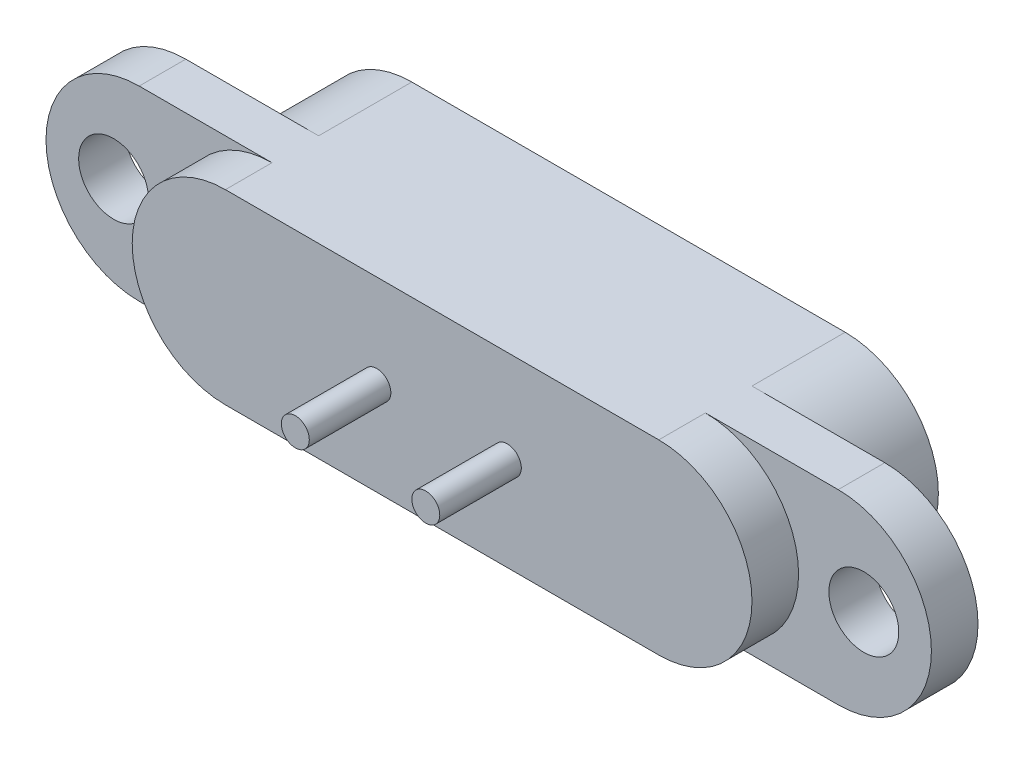
ISO-10303-21;
HEADER;
FILE_DESCRIPTION(('STEP AP214'),'2;1');
FILE_NAME('part.step','',(''),(''),'','','');
FILE_SCHEMA(('AUTOMOTIVE_DESIGN { 1 0 10303 214 1 1 1 1 }'));
ENDSEC;
DATA;
#1=APPLICATION_CONTEXT('core data for automotive mechanical design processes');
#2=APPLICATION_PROTOCOL_DEFINITION('international standard','automotive_design',2000,#1);
#3=PRODUCT_CONTEXT('',#1,'mechanical');
#4=PRODUCT('Part','Part','',(#3));
#5=PRODUCT_RELATED_PRODUCT_CATEGORY('part','',(#4));
#6=PRODUCT_DEFINITION_FORMATION('','',#4);
#7=PRODUCT_DEFINITION_CONTEXT('part definition',#1,'design');
#8=PRODUCT_DEFINITION('design','',#6,#7);
#9=PRODUCT_DEFINITION_SHAPE('','',#8);
#10=(LENGTH_UNIT() NAMED_UNIT(*) SI_UNIT(.MILLI.,.METRE.));
#11=(NAMED_UNIT(*) PLANE_ANGLE_UNIT() SI_UNIT($,.RADIAN.));
#12=(NAMED_UNIT(*) SI_UNIT($,.STERADIAN.) SOLID_ANGLE_UNIT());
#13=UNCERTAINTY_MEASURE_WITH_UNIT(LENGTH_MEASURE(1.E-05),#10,'distance_accuracy_value','');
#14=(GEOMETRIC_REPRESENTATION_CONTEXT(3) GLOBAL_UNCERTAINTY_ASSIGNED_CONTEXT((#13)) GLOBAL_UNIT_ASSIGNED_CONTEXT((#10,
#11,#12)) REPRESENTATION_CONTEXT('',''));
#15=CARTESIAN_POINT('',(0.,0.,0.));
#16=DIRECTION('',(0.,0.,1.));
#17=DIRECTION('',(1.,0.,0.));
#18=AXIS2_PLACEMENT_3D('',#15,#16,#17);
#19=CARTESIAN_POINT('',(0.,0.,4.));
#20=DIRECTION('',(0.,0.,-1.));
#21=DIRECTION('',(-1.,0.,0.));
#22=AXIS2_PLACEMENT_3D('',#19,#20,#21);
#23=CYLINDRICAL_SURFACE('',#22,2.);
#24=CARTESIAN_POINT('',(0.,0.,3.));
#25=DIRECTION('',(0.,0.,-1.));
#26=DIRECTION('',(-1.,0.,0.));
#27=AXIS2_PLACEMENT_3D('',#24,#25,#26);
#28=CIRCLE('',#27,2.);
#29=CARTESIAN_POINT('',(0.,-2.,3.));
#30=VERTEX_POINT('',#29);
#31=CARTESIAN_POINT('',(0.,2.,3.));
#32=VERTEX_POINT('',#31);
#33=EDGE_CURVE('E178',#30,#32,#28,.T.);
#34=ORIENTED_EDGE('',*,*,#33,.F.);
#35=DIRECTION('',(0.,0.,-1.));
#36=VECTOR('',#35,1.);
#37=CARTESIAN_POINT('',(0.,-2.,4.));
#38=LINE('',#37,#36);
#39=CARTESIAN_POINT('',(0.,-2.,4.));
#40=VERTEX_POINT('',#39);
#41=EDGE_CURVE('E11',#40,#30,#38,.T.);
#42=ORIENTED_EDGE('',*,*,#41,.F.);
#43=CARTESIAN_POINT('',(0.,0.,4.));
#44=DIRECTION('',(0.,0.,1.));
#45=DIRECTION('',(1.,0.,0.));
#46=AXIS2_PLACEMENT_3D('',#43,#44,#45);
#47=CIRCLE('',#46,2.);
#48=CARTESIAN_POINT('',(0.,2.,4.));
#49=VERTEX_POINT('',#48);
#50=EDGE_CURVE('E181',#49,#40,#47,.T.);
#51=ORIENTED_EDGE('',*,*,#50,.F.);
#52=DIRECTION('',(0.,0.,-1.));
#53=VECTOR('',#52,1.);
#54=CARTESIAN_POINT('',(0.,2.,4.));
#55=LINE('',#54,#53);
#56=EDGE_CURVE('E202',#49,#32,#55,.T.);
#57=ORIENTED_EDGE('',*,*,#56,.T.);
#58=EDGE_LOOP('',(#34,#42,#51,#57));
#59=FACE_BOUND('',#58,.T.);
#60=ADVANCED_FACE('F33',(#59),#23,.T.);
#61=CARTESIAN_POINT('',(9.3,0.,4.));
#62=DIRECTION('',(0.,0.,-1.));
#63=DIRECTION('',(-1.,0.,0.));
#64=AXIS2_PLACEMENT_3D('',#61,#62,#63);
#65=CYLINDRICAL_SURFACE('',#64,2.);
#66=CARTESIAN_POINT('',(9.3,0.,3.));
#67=DIRECTION('',(0.,0.,-1.));
#68=DIRECTION('',(-1.,0.,0.));
#69=AXIS2_PLACEMENT_3D('',#66,#67,#68);
#70=CIRCLE('',#69,2.);
#71=CARTESIAN_POINT('',(9.3,2.,3.));
#72=VERTEX_POINT('',#71);
#73=CARTESIAN_POINT('',(9.3,-2.,3.));
#74=VERTEX_POINT('',#73);
#75=EDGE_CURVE('E141',#72,#74,#70,.T.);
#76=ORIENTED_EDGE('',*,*,#75,.F.);
#77=DIRECTION('',(0.,0.,-1.));
#78=VECTOR('',#77,1.);
#79=CARTESIAN_POINT('',(9.3,2.,4.));
#80=LINE('',#79,#78);
#81=CARTESIAN_POINT('',(9.3,2.,4.));
#82=VERTEX_POINT('',#81);
#83=EDGE_CURVE('E206',#82,#72,#80,.T.);
#84=ORIENTED_EDGE('',*,*,#83,.F.);
#85=CARTESIAN_POINT('',(9.3,0.,4.));
#86=DIRECTION('',(0.,0.,1.));
#87=DIRECTION('',(1.,0.,0.));
#88=AXIS2_PLACEMENT_3D('',#85,#86,#87);
#89=CIRCLE('',#88,2.);
#90=CARTESIAN_POINT('',(9.3,-2.,4.));
#91=VERTEX_POINT('',#90);
#92=EDGE_CURVE('E187',#91,#82,#89,.T.);
#93=ORIENTED_EDGE('',*,*,#92,.F.);
#94=DIRECTION('',(0.,0.,-1.));
#95=VECTOR('',#94,1.);
#96=CARTESIAN_POINT('',(9.3,-2.,4.));
#97=LINE('',#96,#95);
#98=EDGE_CURVE('E209',#91,#74,#97,.T.);
#99=ORIENTED_EDGE('',*,*,#98,.T.);
#100=EDGE_LOOP('',(#76,#84,#93,#99));
#101=FACE_BOUND('',#100,.T.);
#102=ADVANCED_FACE('F248',(#101),#65,.T.);
#103=CARTESIAN_POINT('',(0.,-2.,2.));
#104=VERTEX_POINT('',#103);
#105=CARTESIAN_POINT('',(0.,-2.,0.));
#106=VERTEX_POINT('',#105);
#107=EDGE_CURVE('E41',#104,#106,#38,.T.);
#108=ORIENTED_EDGE('',*,*,#107,.F.);
#109=CARTESIAN_POINT('',(0.,0.,2.));
#110=DIRECTION('',(0.,0.,-1.));
#111=DIRECTION('',(-1.,0.,0.));
#112=AXIS2_PLACEMENT_3D('',#109,#110,#111);
#113=CIRCLE('',#112,2.);
#114=CARTESIAN_POINT('',(0.,2.,2.));
#115=VERTEX_POINT('',#114);
#116=EDGE_CURVE('E175',#104,#115,#113,.T.);
#117=ORIENTED_EDGE('',*,*,#116,.T.);
#118=CARTESIAN_POINT('',(0.,2.,0.));
#119=VERTEX_POINT('',#118);
#120=EDGE_CURVE('E191',#115,#119,#55,.T.);
#121=ORIENTED_EDGE('',*,*,#120,.T.);
#122=CARTESIAN_POINT('',(0.,0.,0.));
#123=DIRECTION('',(0.,0.,1.));
#124=DIRECTION('',(1.,0.,0.));
#125=AXIS2_PLACEMENT_3D('',#122,#123,#124);
#126=CIRCLE('',#125,2.);
#127=EDGE_CURVE('E180',#119,#106,#126,.T.);
#128=ORIENTED_EDGE('',*,*,#127,.T.);
#129=EDGE_LOOP('',(#108,#117,#121,#128));
#130=FACE_BOUND('',#129,.T.);
#131=ADVANCED_FACE('F35',(#130),#23,.T.);
#132=CARTESIAN_POINT('',(0.,-2.,4.));
#133=DIRECTION('',(0.,1.,0.));
#134=DIRECTION('',(0.,0.,1.));
#135=AXIS2_PLACEMENT_3D('',#132,#133,#134);
#136=PLANE('',#135);
#137=CARTESIAN_POINT('',(9.3,-2.,2.));
#138=VERTEX_POINT('',#137);
#139=CARTESIAN_POINT('',(9.3,-2.,0.));
#140=VERTEX_POINT('',#139);
#141=EDGE_CURVE('E208',#138,#140,#97,.T.);
#142=ORIENTED_EDGE('',*,*,#141,.F.);
#143=DIRECTION('',(-1.,0.,0.));
#144=VECTOR('',#143,1.);
#145=CARTESIAN_POINT('',(12.15,-2.,2.));
#146=LINE('',#145,#144);
#147=CARTESIAN_POINT('',(12.15,-2.,2.));
#148=VERTEX_POINT('',#147);
#149=EDGE_CURVE('E48',#148,#138,#146,.T.);
#150=ORIENTED_EDGE('',*,*,#149,.F.);
#151=DIRECTION('',(0.,0.,-1.));
#152=VECTOR('',#151,1.);
#153=CARTESIAN_POINT('',(12.15,-2.,3.));
#154=LINE('',#153,#152);
#155=CARTESIAN_POINT('',(12.15,-2.,3.));
#156=VERTEX_POINT('',#155);
#157=EDGE_CURVE('E123',#156,#148,#154,.T.);
#158=ORIENTED_EDGE('',*,*,#157,.F.);
#159=DIRECTION('',(-1.,0.,0.));
#160=VECTOR('',#159,1.);
#161=CARTESIAN_POINT('',(12.15,-2.,3.));
#162=LINE('',#161,#160);
#163=EDGE_CURVE('E128',#156,#74,#162,.T.);
#164=ORIENTED_EDGE('',*,*,#163,.T.);
#165=ORIENTED_EDGE('',*,*,#98,.F.);
#166=DIRECTION('',(1.,0.,0.));
#167=VECTOR('',#166,1.);
#168=CARTESIAN_POINT('',(0.,-2.,4.));
#169=LINE('',#168,#167);
#170=EDGE_CURVE('E184',#40,#91,#169,.T.);
#171=ORIENTED_EDGE('',*,*,#170,.F.);
#172=ORIENTED_EDGE('',*,*,#41,.T.);
#173=CARTESIAN_POINT('',(-2.84999999999998,-2.,3.));
#174=VERTEX_POINT('',#173);
#175=EDGE_CURVE('E143',#30,#174,#162,.T.);
#176=ORIENTED_EDGE('',*,*,#175,.T.);
#177=DIRECTION('',(0.,0.,-1.));
#178=VECTOR('',#177,1.);
#179=CARTESIAN_POINT('',(-2.84999999999998,-2.,3.));
#180=LINE('',#179,#178);
#181=CARTESIAN_POINT('',(-2.84999999999998,-2.,2.));
#182=VERTEX_POINT('',#181);
#183=EDGE_CURVE('E133',#174,#182,#180,.T.);
#184=ORIENTED_EDGE('',*,*,#183,.T.);
#185=EDGE_CURVE('E163',#104,#182,#146,.T.);
#186=ORIENTED_EDGE('',*,*,#185,.F.);
#187=ORIENTED_EDGE('',*,*,#107,.T.);
#188=DIRECTION('',(1.,0.,0.));
#189=VECTOR('',#188,1.);
#190=CARTESIAN_POINT('',(0.,-2.,0.));
#191=LINE('',#190,#189);
#192=EDGE_CURVE('E194',#106,#140,#191,.T.);
#193=ORIENTED_EDGE('',*,*,#192,.T.);
#194=EDGE_LOOP('',(#142,#150,#158,#164,#165,#171,#172,#176,#184,#186,#187,#193));
#195=FACE_BOUND('',#194,.T.);
#196=ADVANCED_FACE('F126',(#195),#136,.F.);
#197=CARTESIAN_POINT('',(9.3,2.,2.));
#198=VERTEX_POINT('',#197);
#199=CARTESIAN_POINT('',(9.3,2.,0.));
#200=VERTEX_POINT('',#199);
#201=EDGE_CURVE('E205',#198,#200,#80,.T.);
#202=ORIENTED_EDGE('',*,*,#201,.F.);
#203=CARTESIAN_POINT('',(9.3,0.,2.));
#204=DIRECTION('',(0.,0.,-1.));
#205=DIRECTION('',(-1.,0.,0.));
#206=AXIS2_PLACEMENT_3D('',#203,#204,#205);
#207=CIRCLE('',#206,2.);
#208=EDGE_CURVE('E169',#198,#138,#207,.T.);
#209=ORIENTED_EDGE('',*,*,#208,.T.);
#210=ORIENTED_EDGE('',*,*,#141,.T.);
#211=CARTESIAN_POINT('',(9.3,0.,0.));
#212=DIRECTION('',(0.,0.,1.));
#213=DIRECTION('',(1.,0.,0.));
#214=AXIS2_PLACEMENT_3D('',#211,#212,#213);
#215=CIRCLE('',#214,2.);
#216=EDGE_CURVE('E197',#140,#200,#215,.T.);
#217=ORIENTED_EDGE('',*,*,#216,.T.);
#218=EDGE_LOOP('',(#202,#209,#210,#217));
#219=FACE_BOUND('',#218,.T.);
#220=ADVANCED_FACE('F214',(#219),#65,.T.);
#221=CARTESIAN_POINT('',(0.,2.,4.));
#222=DIRECTION('',(0.,-1.,0.));
#223=DIRECTION('',(0.,0.,-1.));
#224=AXIS2_PLACEMENT_3D('',#221,#222,#223);
#225=PLANE('',#224);
#226=ORIENTED_EDGE('',*,*,#120,.F.);
#227=DIRECTION('',(1.,0.,0.));
#228=VECTOR('',#227,1.);
#229=CARTESIAN_POINT('',(12.15,2.,2.));
#230=LINE('',#229,#228);
#231=CARTESIAN_POINT('',(-2.84999999999998,2.,2.));
#232=VERTEX_POINT('',#231);
#233=EDGE_CURVE('E56',#232,#115,#230,.T.);
#234=ORIENTED_EDGE('',*,*,#233,.F.);
#235=DIRECTION('',(0.,0.,-1.));
#236=VECTOR('',#235,1.);
#237=CARTESIAN_POINT('',(-2.84999999999998,2.,3.));
#238=LINE('',#237,#236);
#239=CARTESIAN_POINT('',(-2.84999999999998,2.,3.));
#240=VERTEX_POINT('',#239);
#241=EDGE_CURVE('E170',#240,#232,#238,.T.);
#242=ORIENTED_EDGE('',*,*,#241,.F.);
#243=DIRECTION('',(1.,0.,0.));
#244=VECTOR('',#243,1.);
#245=CARTESIAN_POINT('',(12.15,2.,3.));
#246=LINE('',#245,#244);
#247=EDGE_CURVE('E134',#240,#32,#246,.T.);
#248=ORIENTED_EDGE('',*,*,#247,.T.);
#249=ORIENTED_EDGE('',*,*,#56,.F.);
#250=DIRECTION('',(-1.,0.,0.));
#251=VECTOR('',#250,1.);
#252=CARTESIAN_POINT('',(0.,2.,4.));
#253=LINE('',#252,#251);
#254=EDGE_CURVE('E189',#82,#49,#253,.T.);
#255=ORIENTED_EDGE('',*,*,#254,.F.);
#256=ORIENTED_EDGE('',*,*,#83,.T.);
#257=CARTESIAN_POINT('',(12.15,2.,3.));
#258=VERTEX_POINT('',#257);
#259=EDGE_CURVE('E158',#72,#258,#246,.T.);
#260=ORIENTED_EDGE('',*,*,#259,.T.);
#261=DIRECTION('',(0.,0.,-1.));
#262=VECTOR('',#261,1.);
#263=CARTESIAN_POINT('',(12.15,2.,3.));
#264=LINE('',#263,#262);
#265=CARTESIAN_POINT('',(12.15,2.,2.));
#266=VERTEX_POINT('',#265);
#267=EDGE_CURVE('E148',#258,#266,#264,.T.);
#268=ORIENTED_EDGE('',*,*,#267,.T.);
#269=EDGE_CURVE('E150',#198,#266,#230,.T.);
#270=ORIENTED_EDGE('',*,*,#269,.F.);
#271=ORIENTED_EDGE('',*,*,#201,.T.);
#272=DIRECTION('',(-1.,0.,0.));
#273=VECTOR('',#272,1.);
#274=CARTESIAN_POINT('',(0.,2.,0.));
#275=LINE('',#274,#273);
#276=EDGE_CURVE('E185',#200,#119,#275,.T.);
#277=ORIENTED_EDGE('',*,*,#276,.T.);
#278=EDGE_LOOP('',(#226,#234,#242,#248,#249,#255,#256,#260,#268,#270,#271,#277));
#279=FACE_BOUND('',#278,.T.);
#280=ADVANCED_FACE('F225',(#279),#225,.F.);
#281=CARTESIAN_POINT('',(0.,0.,4.));
#282=DIRECTION('',(0.,0.,1.));
#283=DIRECTION('',(1.,0.,0.));
#284=AXIS2_PLACEMENT_3D('',#281,#282,#283);
#285=PLANE('',#284);
#286=CARTESIAN_POINT('',(6.05,0.,4.));
#287=DIRECTION('',(0.,0.,1.));
#288=DIRECTION('',(1.,0.,0.));
#289=AXIS2_PLACEMENT_3D('',#286,#287,#288);
#290=CIRCLE('',#289,0.3);
#291=CARTESIAN_POINT('',(6.35,0.,4.));
#292=VERTEX_POINT('',#291);
#293=EDGE_CURVE('E450',#292,#292,#290,.T.);
#294=ORIENTED_EDGE('',*,*,#293,.F.);
#295=EDGE_LOOP('',(#294));
#296=FACE_BOUND('',#295,.T.);
#297=CARTESIAN_POINT('',(3.25,0.,4.));
#298=DIRECTION('',(0.,0.,1.));
#299=DIRECTION('',(1.,0.,0.));
#300=AXIS2_PLACEMENT_3D('',#297,#298,#299);
#301=CIRCLE('',#300,0.3);
#302=CARTESIAN_POINT('',(3.55,0.,4.));
#303=VERTEX_POINT('',#302);
#304=EDGE_CURVE('E449',#303,#303,#301,.T.);
#305=ORIENTED_EDGE('',*,*,#304,.F.);
#306=EDGE_LOOP('',(#305));
#307=FACE_BOUND('',#306,.T.);
#308=ORIENTED_EDGE('',*,*,#50,.T.);
#309=ORIENTED_EDGE('',*,*,#170,.T.);
#310=ORIENTED_EDGE('',*,*,#92,.T.);
#311=ORIENTED_EDGE('',*,*,#254,.T.);
#312=EDGE_LOOP('',(#308,#309,#310,#311));
#313=FACE_BOUND('',#312,.T.);
#314=ADVANCED_FACE('F270',(#296,#307,#313),#285,.T.);
#315=CARTESIAN_POINT('',(0.,0.,0.));
#316=DIRECTION('',(0.,0.,1.));
#317=DIRECTION('',(1.,0.,0.));
#318=AXIS2_PLACEMENT_3D('',#315,#316,#317);
#319=PLANE('',#318);
#320=CARTESIAN_POINT('',(6.05,0.,0.));
#321=DIRECTION('',(0.,0.,-1.));
#322=DIRECTION('',(-1.,0.,0.));
#323=AXIS2_PLACEMENT_3D('',#320,#321,#322);
#324=CIRCLE('',#323,0.749999999999999);
#325=CARTESIAN_POINT('',(5.3,0.,0.));
#326=VERTEX_POINT('',#325);
#327=EDGE_CURVE('E465',#326,#326,#324,.T.);
#328=ORIENTED_EDGE('',*,*,#327,.F.);
#329=EDGE_LOOP('',(#328));
#330=FACE_BOUND('',#329,.T.);
#331=CARTESIAN_POINT('',(3.25,0.,0.));
#332=DIRECTION('',(0.,0.,-1.));
#333=DIRECTION('',(-1.,0.,0.));
#334=AXIS2_PLACEMENT_3D('',#331,#332,#333);
#335=CIRCLE('',#334,0.75);
#336=CARTESIAN_POINT('',(2.5,0.,0.));
#337=VERTEX_POINT('',#336);
#338=EDGE_CURVE('E459',#337,#337,#335,.T.);
#339=ORIENTED_EDGE('',*,*,#338,.F.);
#340=EDGE_LOOP('',(#339));
#341=FACE_BOUND('',#340,.T.);
#342=ORIENTED_EDGE('',*,*,#127,.F.);
#343=ORIENTED_EDGE('',*,*,#276,.F.);
#344=ORIENTED_EDGE('',*,*,#216,.F.);
#345=ORIENTED_EDGE('',*,*,#192,.F.);
#346=EDGE_LOOP('',(#342,#343,#344,#345));
#347=FACE_BOUND('',#346,.T.);
#348=ADVANCED_FACE('F222',(#330,#341,#347),#319,.F.);
#349=CARTESIAN_POINT('',(12.15,0.,3.));
#350=DIRECTION('',(0.,0.,-1.));
#351=DIRECTION('',(-1.,0.,0.));
#352=AXIS2_PLACEMENT_3D('',#349,#350,#351);
#353=CYLINDRICAL_SURFACE('',#352,2.);
#354=CARTESIAN_POINT('',(12.15,0.,2.));
#355=DIRECTION('',(0.,0.,-1.));
#356=DIRECTION('',(-1.,0.,0.));
#357=AXIS2_PLACEMENT_3D('',#354,#355,#356);
#358=CIRCLE('',#357,2.);
#359=EDGE_CURVE('E161',#266,#148,#358,.T.);
#360=ORIENTED_EDGE('',*,*,#359,.F.);
#361=ORIENTED_EDGE('',*,*,#267,.F.);
#362=CARTESIAN_POINT('',(12.15,0.,3.));
#363=DIRECTION('',(0.,0.,-1.));
#364=DIRECTION('',(-1.,0.,0.));
#365=AXIS2_PLACEMENT_3D('',#362,#363,#364);
#366=CIRCLE('',#365,2.);
#367=EDGE_CURVE('E139',#258,#156,#366,.T.);
#368=ORIENTED_EDGE('',*,*,#367,.T.);
#369=ORIENTED_EDGE('',*,*,#157,.T.);
#370=EDGE_LOOP('',(#360,#361,#368,#369));
#371=FACE_BOUND('',#370,.T.);
#372=ADVANCED_FACE('F146',(#371),#353,.T.);
#373=CARTESIAN_POINT('',(12.7,0.,3.));
#374=DIRECTION('',(0.,0.,-1.));
#375=DIRECTION('',(-1.,0.,0.));
#376=AXIS2_PLACEMENT_3D('',#373,#374,#375);
#377=CYLINDRICAL_SURFACE('',#376,0.75);
#378=CARTESIAN_POINT('',(12.7,0.,3.));
#379=DIRECTION('',(0.,0.,-1.));
#380=DIRECTION('',(-1.,0.,0.));
#381=AXIS2_PLACEMENT_3D('',#378,#379,#380);
#382=CIRCLE('',#381,0.75);
#383=CARTESIAN_POINT('',(11.95,0.,3.));
#384=VERTEX_POINT('',#383);
#385=EDGE_CURVE('E473',#384,#384,#382,.T.);
#386=ORIENTED_EDGE('',*,*,#385,.F.);
#387=EDGE_LOOP('',(#386));
#388=FACE_BOUND('',#387,.T.);
#389=CARTESIAN_POINT('',(12.7,0.,2.));
#390=DIRECTION('',(0.,0.,-1.));
#391=DIRECTION('',(-1.,0.,0.));
#392=AXIS2_PLACEMENT_3D('',#389,#390,#391);
#393=CIRCLE('',#392,0.75);
#394=CARTESIAN_POINT('',(11.95,0.,2.));
#395=VERTEX_POINT('',#394);
#396=EDGE_CURVE('E464',#395,#395,#393,.T.);
#397=ORIENTED_EDGE('',*,*,#396,.T.);
#398=EDGE_LOOP('',(#397));
#399=FACE_BOUND('',#398,.T.);
#400=ADVANCED_FACE('F229',(#388,#399),#377,.F.);
#401=CARTESIAN_POINT('',(12.15,0.,2.));
#402=DIRECTION('',(0.,0.,-1.));
#403=DIRECTION('',(-1.,0.,0.));
#404=AXIS2_PLACEMENT_3D('',#401,#402,#403);
#405=PLANE('',#404);
#406=ORIENTED_EDGE('',*,*,#396,.F.);
#407=EDGE_LOOP('',(#406));
#408=FACE_BOUND('',#407,.T.);
#409=ORIENTED_EDGE('',*,*,#208,.F.);
#410=ORIENTED_EDGE('',*,*,#269,.T.);
#411=ORIENTED_EDGE('',*,*,#359,.T.);
#412=ORIENTED_EDGE('',*,*,#149,.T.);
#413=EDGE_LOOP('',(#409,#410,#411,#412));
#414=FACE_BOUND('',#413,.T.);
#415=ADVANCED_FACE('F227',(#408,#414),#405,.T.);
#416=CARTESIAN_POINT('',(12.15,0.,3.));
#417=DIRECTION('',(0.,0.,-1.));
#418=DIRECTION('',(-1.,0.,0.));
#419=AXIS2_PLACEMENT_3D('',#416,#417,#418);
#420=PLANE('',#419);
#421=ORIENTED_EDGE('',*,*,#385,.T.);
#422=EDGE_LOOP('',(#421));
#423=FACE_BOUND('',#422,.T.);
#424=ORIENTED_EDGE('',*,*,#259,.F.);
#425=ORIENTED_EDGE('',*,*,#75,.T.);
#426=ORIENTED_EDGE('',*,*,#163,.F.);
#427=ORIENTED_EDGE('',*,*,#367,.F.);
#428=EDGE_LOOP('',(#424,#425,#426,#427));
#429=FACE_BOUND('',#428,.T.);
#430=ADVANCED_FACE('F138',(#423,#429),#420,.F.);
#431=CARTESIAN_POINT('',(-3.4,0.,3.));
#432=DIRECTION('',(0.,0.,-1.));
#433=DIRECTION('',(-1.,0.,0.));
#434=AXIS2_PLACEMENT_3D('',#431,#432,#433);
#435=CIRCLE('',#434,0.75);
#436=CARTESIAN_POINT('',(-4.15,0.,3.));
#437=VERTEX_POINT('',#436);
#438=EDGE_CURVE('E164',#437,#437,#435,.T.);
#439=ORIENTED_EDGE('',*,*,#438,.T.);
#440=EDGE_LOOP('',(#439));
#441=FACE_BOUND('',#440,.T.);
#442=ORIENTED_EDGE('',*,*,#175,.F.);
#443=ORIENTED_EDGE('',*,*,#33,.T.);
#444=ORIENTED_EDGE('',*,*,#247,.F.);
#445=CARTESIAN_POINT('',(-2.85,0.,3.));
#446=DIRECTION('',(0.,0.,-1.));
#447=DIRECTION('',(-1.,0.,0.));
#448=AXIS2_PLACEMENT_3D('',#445,#446,#447);
#449=CIRCLE('',#448,2.);
#450=EDGE_CURVE('E142',#174,#240,#449,.T.);
#451=ORIENTED_EDGE('',*,*,#450,.F.);
#452=EDGE_LOOP('',(#442,#443,#444,#451));
#453=FACE_BOUND('',#452,.T.);
#454=ADVANCED_FACE('F237',(#441,#453),#420,.F.);
#455=CARTESIAN_POINT('',(-3.4,0.,2.));
#456=DIRECTION('',(0.,0.,-1.));
#457=DIRECTION('',(-1.,0.,0.));
#458=AXIS2_PLACEMENT_3D('',#455,#456,#457);
#459=CIRCLE('',#458,0.75);
#460=CARTESIAN_POINT('',(-4.15,0.,2.));
#461=VERTEX_POINT('',#460);
#462=EDGE_CURVE('E153',#461,#461,#459,.T.);
#463=ORIENTED_EDGE('',*,*,#462,.F.);
#464=EDGE_LOOP('',(#463));
#465=FACE_BOUND('',#464,.T.);
#466=ORIENTED_EDGE('',*,*,#116,.F.);
#467=ORIENTED_EDGE('',*,*,#185,.T.);
#468=CARTESIAN_POINT('',(-2.85,0.,2.));
#469=DIRECTION('',(0.,0.,-1.));
#470=DIRECTION('',(-1.,0.,0.));
#471=AXIS2_PLACEMENT_3D('',#468,#469,#470);
#472=CIRCLE('',#471,2.);
#473=EDGE_CURVE('E166',#182,#232,#472,.T.);
#474=ORIENTED_EDGE('',*,*,#473,.T.);
#475=ORIENTED_EDGE('',*,*,#233,.T.);
#476=EDGE_LOOP('',(#466,#467,#474,#475));
#477=FACE_BOUND('',#476,.T.);
#478=ADVANCED_FACE('F232',(#465,#477),#405,.T.);
#479=CARTESIAN_POINT('',(-2.85,0.,3.));
#480=DIRECTION('',(0.,0.,-1.));
#481=DIRECTION('',(-1.,0.,0.));
#482=AXIS2_PLACEMENT_3D('',#479,#480,#481);
#483=CYLINDRICAL_SURFACE('',#482,2.);
#484=ORIENTED_EDGE('',*,*,#473,.F.);
#485=ORIENTED_EDGE('',*,*,#183,.F.);
#486=ORIENTED_EDGE('',*,*,#450,.T.);
#487=ORIENTED_EDGE('',*,*,#241,.T.);
#488=EDGE_LOOP('',(#484,#485,#486,#487));
#489=FACE_BOUND('',#488,.T.);
#490=ADVANCED_FACE('F245',(#489),#483,.T.);
#491=CARTESIAN_POINT('',(-3.4,0.,3.));
#492=DIRECTION('',(0.,0.,-1.));
#493=DIRECTION('',(-1.,0.,0.));
#494=AXIS2_PLACEMENT_3D('',#491,#492,#493);
#495=CYLINDRICAL_SURFACE('',#494,0.75);
#496=ORIENTED_EDGE('',*,*,#438,.F.);
#497=EDGE_LOOP('',(#496));
#498=FACE_BOUND('',#497,.T.);
#499=ORIENTED_EDGE('',*,*,#462,.T.);
#500=EDGE_LOOP('',(#499));
#501=FACE_BOUND('',#500,.T.);
#502=ADVANCED_FACE('F343',(#498,#501),#495,.F.);
#503=CARTESIAN_POINT('',(3.25,0.,0.1));
#504=DIRECTION('',(0.,0.,-1.));
#505=DIRECTION('',(-1.,0.,0.));
#506=AXIS2_PLACEMENT_3D('',#503,#504,#505);
#507=CYLINDRICAL_SURFACE('',#506,0.75);
#508=CARTESIAN_POINT('',(3.25,0.,0.1));
#509=DIRECTION('',(0.,0.,-1.));
#510=DIRECTION('',(-1.,0.,0.));
#511=AXIS2_PLACEMENT_3D('',#508,#509,#510);
#512=CIRCLE('',#511,0.75);
#513=CARTESIAN_POINT('',(2.5,0.,0.1));
#514=VERTEX_POINT('',#513);
#515=EDGE_CURVE('E468',#514,#514,#512,.T.);
#516=ORIENTED_EDGE('',*,*,#515,.F.);
#517=EDGE_LOOP('',(#516));
#518=FACE_BOUND('',#517,.T.);
#519=ORIENTED_EDGE('',*,*,#338,.T.);
#520=EDGE_LOOP('',(#519));
#521=FACE_BOUND('',#520,.T.);
#522=ADVANCED_FACE('F351',(#518,#521),#507,.F.);
#523=CARTESIAN_POINT('',(3.25,0.,0.1));
#524=DIRECTION('',(0.,0.,-1.));
#525=DIRECTION('',(-1.,0.,0.));
#526=AXIS2_PLACEMENT_3D('',#523,#524,#525);
#527=PLANE('',#526);
#528=ORIENTED_EDGE('',*,*,#515,.T.);
#529=EDGE_LOOP('',(#528));
#530=FACE_BOUND('',#529,.T.);
#531=ADVANCED_FACE('F369',(#530),#527,.T.);
#532=CARTESIAN_POINT('',(6.05,0.,0.1));
#533=DIRECTION('',(0.,0.,-1.));
#534=DIRECTION('',(-1.,0.,0.));
#535=AXIS2_PLACEMENT_3D('',#532,#533,#534);
#536=CYLINDRICAL_SURFACE('',#535,0.749999999999999);
#537=CARTESIAN_POINT('',(6.05,0.,0.1));
#538=DIRECTION('',(0.,0.,-1.));
#539=DIRECTION('',(-1.,0.,0.));
#540=AXIS2_PLACEMENT_3D('',#537,#538,#539);
#541=CIRCLE('',#540,0.749999999999999);
#542=CARTESIAN_POINT('',(5.3,0.,0.1));
#543=VERTEX_POINT('',#542);
#544=EDGE_CURVE('E461',#543,#543,#541,.T.);
#545=ORIENTED_EDGE('',*,*,#544,.F.);
#546=EDGE_LOOP('',(#545));
#547=FACE_BOUND('',#546,.T.);
#548=ORIENTED_EDGE('',*,*,#327,.T.);
#549=EDGE_LOOP('',(#548));
#550=FACE_BOUND('',#549,.T.);
#551=ADVANCED_FACE('F379',(#547,#550),#536,.F.);
#552=CARTESIAN_POINT('',(6.05,0.,0.1));
#553=DIRECTION('',(0.,0.,-1.));
#554=DIRECTION('',(-1.,0.,0.));
#555=AXIS2_PLACEMENT_3D('',#552,#553,#554);
#556=PLANE('',#555);
#557=ORIENTED_EDGE('',*,*,#544,.T.);
#558=EDGE_LOOP('',(#557));
#559=FACE_BOUND('',#558,.T.);
#560=ADVANCED_FACE('F389',(#559),#556,.T.);
#561=CARTESIAN_POINT('',(3.25,0.,5.75));
#562=DIRECTION('',(0.,0.,-1.));
#563=DIRECTION('',(-1.,0.,0.));
#564=AXIS2_PLACEMENT_3D('',#561,#562,#563);
#565=CYLINDRICAL_SURFACE('',#564,0.3);
#566=CARTESIAN_POINT('',(3.25,0.,5.75));
#567=DIRECTION('',(0.,0.,1.));
#568=DIRECTION('',(1.,0.,0.));
#569=AXIS2_PLACEMENT_3D('',#566,#567,#568);
#570=CIRCLE('',#569,0.3);
#571=CARTESIAN_POINT('',(3.55,0.,5.75));
#572=VERTEX_POINT('',#571);
#573=EDGE_CURVE('E453',#572,#572,#570,.T.);
#574=ORIENTED_EDGE('',*,*,#573,.F.);
#575=EDGE_LOOP('',(#574));
#576=FACE_BOUND('',#575,.T.);
#577=ORIENTED_EDGE('',*,*,#304,.T.);
#578=EDGE_LOOP('',(#577));
#579=FACE_BOUND('',#578,.T.);
#580=ADVANCED_FACE('F398',(#576,#579),#565,.T.);
#581=CARTESIAN_POINT('',(3.25,0.,5.75));
#582=DIRECTION('',(0.,0.,1.));
#583=DIRECTION('',(1.,0.,0.));
#584=AXIS2_PLACEMENT_3D('',#581,#582,#583);
#585=PLANE('',#584);
#586=ORIENTED_EDGE('',*,*,#573,.T.);
#587=EDGE_LOOP('',(#586));
#588=FACE_BOUND('',#587,.T.);
#589=ADVANCED_FACE('F412',(#588),#585,.T.);
#590=CARTESIAN_POINT('',(6.05,0.,5.75));
#591=DIRECTION('',(0.,0.,-1.));
#592=DIRECTION('',(-1.,0.,0.));
#593=AXIS2_PLACEMENT_3D('',#590,#591,#592);
#594=CYLINDRICAL_SURFACE('',#593,0.3);
#595=CARTESIAN_POINT('',(6.05,0.,5.75));
#596=DIRECTION('',(0.,0.,1.));
#597=DIRECTION('',(1.,0.,0.));
#598=AXIS2_PLACEMENT_3D('',#595,#596,#597);
#599=CIRCLE('',#598,0.3);
#600=CARTESIAN_POINT('',(6.35,0.,5.75));
#601=VERTEX_POINT('',#600);
#602=EDGE_CURVE('E448',#601,#601,#599,.T.);
#603=ORIENTED_EDGE('',*,*,#602,.F.);
#604=EDGE_LOOP('',(#603));
#605=FACE_BOUND('',#604,.T.);
#606=ORIENTED_EDGE('',*,*,#293,.T.);
#607=EDGE_LOOP('',(#606));
#608=FACE_BOUND('',#607,.T.);
#609=ADVANCED_FACE('F422',(#605,#608),#594,.T.);
#610=CARTESIAN_POINT('',(6.05,0.,5.75));
#611=DIRECTION('',(0.,0.,1.));
#612=DIRECTION('',(1.,0.,0.));
#613=AXIS2_PLACEMENT_3D('',#610,#611,#612);
#614=PLANE('',#613);
#615=ORIENTED_EDGE('',*,*,#602,.T.);
#616=EDGE_LOOP('',(#615));
#617=FACE_BOUND('',#616,.T.);
#618=ADVANCED_FACE('F432',(#617),#614,.T.);
#619=CLOSED_SHELL('',(#60,#102,#131,#196,#220,#280,#314,#348,#372,#400,#415,#430,#454,#478,#490,
#502,#522,#531,#551,#560,#580,#589,#609,#618));
#620=MANIFOLD_SOLID_BREP('B2',#619);
#621=ADVANCED_BREP_SHAPE_REPRESENTATION('',(#18,#620),#14);
#622=SHAPE_DEFINITION_REPRESENTATION(#9,#621);
ENDSEC;
END-ISO-10303-21;
